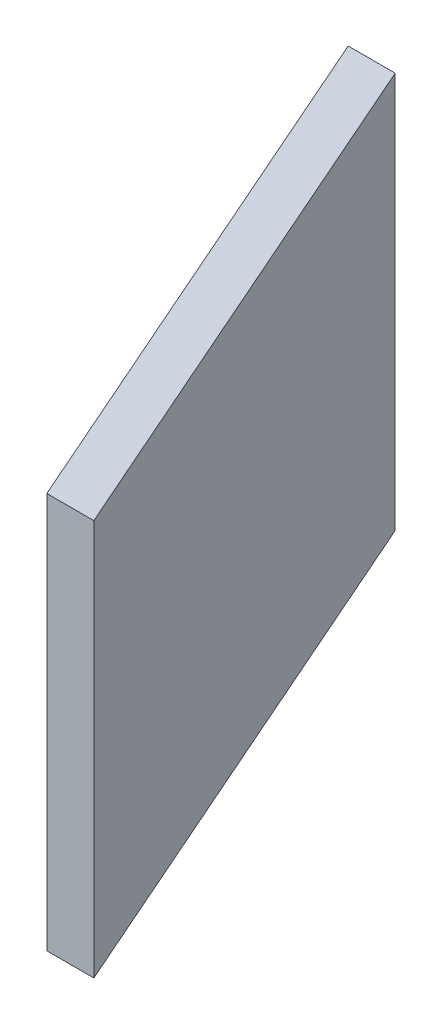
ISO-10303-21;
HEADER;
FILE_DESCRIPTION(('STEP AP214'),'2;1');
FILE_NAME('part.step','',(''),(''),'','','');
FILE_SCHEMA(('AUTOMOTIVE_DESIGN { 1 0 10303 214 1 1 1 1 }'));
ENDSEC;
DATA;
#1=APPLICATION_CONTEXT('core data for automotive mechanical design processes');
#2=APPLICATION_PROTOCOL_DEFINITION('international standard','automotive_design',2000,#1);
#3=PRODUCT_CONTEXT('',#1,'mechanical');
#4=PRODUCT('Part','Part','',(#3));
#5=PRODUCT_RELATED_PRODUCT_CATEGORY('part','',(#4));
#6=PRODUCT_DEFINITION_FORMATION('','',#4);
#7=PRODUCT_DEFINITION_CONTEXT('part definition',#1,'design');
#8=PRODUCT_DEFINITION('design','',#6,#7);
#9=PRODUCT_DEFINITION_SHAPE('','',#8);
#10=(LENGTH_UNIT() NAMED_UNIT(*) SI_UNIT(.MILLI.,.METRE.));
#11=(NAMED_UNIT(*) PLANE_ANGLE_UNIT() SI_UNIT($,.RADIAN.));
#12=(NAMED_UNIT(*) SI_UNIT($,.STERADIAN.) SOLID_ANGLE_UNIT());
#13=UNCERTAINTY_MEASURE_WITH_UNIT(LENGTH_MEASURE(1.E-05),#10,'distance_accuracy_value','');
#14=(GEOMETRIC_REPRESENTATION_CONTEXT(3) GLOBAL_UNCERTAINTY_ASSIGNED_CONTEXT((#13)) GLOBAL_UNIT_ASSIGNED_CONTEXT((#10,
#11,#12)) REPRESENTATION_CONTEXT('',''));
#15=CARTESIAN_POINT('',(0.,0.,0.));
#16=DIRECTION('',(0.,0.,1.));
#17=DIRECTION('',(1.,0.,0.));
#18=AXIS2_PLACEMENT_3D('',#15,#16,#17);
#19=CARTESIAN_POINT('',(2.18504852787824,18.4,0.));
#20=DIRECTION('',(0.,0.,-1.));
#21=DIRECTION('',(-1.,0.,0.));
#22=AXIS2_PLACEMENT_3D('',#19,#20,#21);
#23=PLANE('',#22);
#24=DIRECTION('',(1.,0.,0.));
#25=VECTOR('',#24,1.);
#26=CARTESIAN_POINT('',(2.18504852787824,0.,0.));
#27=LINE('',#26,#25);
#28=CARTESIAN_POINT('',(0.,0.,0.));
#29=VERTEX_POINT('',#28);
#30=CARTESIAN_POINT('',(2.18504852787824,0.,0.));
#31=VERTEX_POINT('',#30);
#32=EDGE_CURVE('E100',#29,#31,#27,.T.);
#33=ORIENTED_EDGE('',*,*,#32,.T.);
#34=DIRECTION('',(0.,-1.,0.));
#35=VECTOR('',#34,1.);
#36=CARTESIAN_POINT('',(2.18504852787824,18.4,0.));
#37=LINE('',#36,#35);
#38=CARTESIAN_POINT('',(2.18504852787824,18.4,0.));
#39=VERTEX_POINT('',#38);
#40=EDGE_CURVE('E11',#39,#31,#37,.T.);
#41=ORIENTED_EDGE('',*,*,#40,.F.);
#42=DIRECTION('',(1.,0.,0.));
#43=VECTOR('',#42,1.);
#44=CARTESIAN_POINT('',(2.18504852787824,18.4,0.));
#45=LINE('',#44,#43);
#46=CARTESIAN_POINT('',(0.,18.4,0.));
#47=VERTEX_POINT('',#46);
#48=EDGE_CURVE('E88',#47,#39,#45,.T.);
#49=ORIENTED_EDGE('',*,*,#48,.F.);
#50=DIRECTION('',(0.,-1.,0.));
#51=VECTOR('',#50,1.);
#52=CARTESIAN_POINT('',(0.,18.4,0.));
#53=LINE('',#52,#51);
#54=EDGE_CURVE('E96',#47,#29,#53,.T.);
#55=ORIENTED_EDGE('',*,*,#54,.T.);
#56=EDGE_LOOP('',(#33,#41,#49,#55));
#57=FACE_BOUND('',#56,.T.);
#58=ADVANCED_FACE('F37',(#57),#23,.F.);
#59=CARTESIAN_POINT('',(-8.81521474441752,18.4,-25.));
#60=DIRECTION('',(-0.915311479119448,0.,0.402746689858735));
#61=DIRECTION('',(0.402746689858735,0.,0.915311479119448));
#62=AXIS2_PLACEMENT_3D('',#59,#60,#61);
#63=PLANE('',#62);
#64=DIRECTION('',(-0.402746689858735,0.,-0.915311479119448));
#65=VECTOR('',#64,1.);
#66=CARTESIAN_POINT('',(-8.81521474441752,0.,-25.));
#67=LINE('',#66,#65);
#68=CARTESIAN_POINT('',(-8.81521474441752,0.,-25.));
#69=VERTEX_POINT('',#68);
#70=EDGE_CURVE('E92',#31,#69,#67,.T.);
#71=ORIENTED_EDGE('',*,*,#70,.T.);
#72=DIRECTION('',(0.,-1.,0.));
#73=VECTOR('',#72,1.);
#74=CARTESIAN_POINT('',(-8.81521474441752,18.4,-25.));
#75=LINE('',#74,#73);
#76=CARTESIAN_POINT('',(-8.81521474441752,18.4,-25.));
#77=VERTEX_POINT('',#76);
#78=EDGE_CURVE('E45',#77,#69,#75,.T.);
#79=ORIENTED_EDGE('',*,*,#78,.F.);
#80=DIRECTION('',(-0.402746689858735,0.,-0.915311479119448));
#81=VECTOR('',#80,1.);
#82=CARTESIAN_POINT('',(-8.81521474441752,18.4,-25.));
#83=LINE('',#82,#81);
#84=EDGE_CURVE('E83',#39,#77,#83,.T.);
#85=ORIENTED_EDGE('',*,*,#84,.F.);
#86=ORIENTED_EDGE('',*,*,#40,.T.);
#87=EDGE_LOOP('',(#71,#79,#85,#86));
#88=FACE_BOUND('',#87,.T.);
#89=ADVANCED_FACE('F91',(#88),#63,.F.);
#90=CARTESIAN_POINT('',(-11.0002632722958,18.4,-25.));
#91=DIRECTION('',(0.,0.,1.));
#92=DIRECTION('',(1.,0.,0.));
#93=AXIS2_PLACEMENT_3D('',#90,#91,#92);
#94=PLANE('',#93);
#95=DIRECTION('',(-1.,0.,0.));
#96=VECTOR('',#95,1.);
#97=CARTESIAN_POINT('',(-11.0002632722958,0.,-25.));
#98=LINE('',#97,#96);
#99=CARTESIAN_POINT('',(-11.0002632722958,0.,-25.));
#100=VERTEX_POINT('',#99);
#101=EDGE_CURVE('E70',#69,#100,#98,.T.);
#102=ORIENTED_EDGE('',*,*,#101,.T.);
#103=DIRECTION('',(0.,-1.,0.));
#104=VECTOR('',#103,1.);
#105=CARTESIAN_POINT('',(-11.0002632722958,18.4,-25.));
#106=LINE('',#105,#104);
#107=CARTESIAN_POINT('',(-11.0002632722958,18.4,-25.));
#108=VERTEX_POINT('',#107);
#109=EDGE_CURVE('E93',#108,#100,#106,.T.);
#110=ORIENTED_EDGE('',*,*,#109,.F.);
#111=DIRECTION('',(-1.,0.,0.));
#112=VECTOR('',#111,1.);
#113=CARTESIAN_POINT('',(-11.0002632722958,18.4,-25.));
#114=LINE('',#113,#112);
#115=EDGE_CURVE('E86',#77,#108,#114,.T.);
#116=ORIENTED_EDGE('',*,*,#115,.F.);
#117=ORIENTED_EDGE('',*,*,#78,.T.);
#118=EDGE_LOOP('',(#102,#110,#116,#117));
#119=FACE_BOUND('',#118,.T.);
#120=ADVANCED_FACE('F94',(#119),#94,.F.);
#121=CARTESIAN_POINT('',(0.,18.4,0.));
#122=DIRECTION('',(0.915311479119448,0.,-0.402746689858735));
#123=DIRECTION('',(-0.402746689858735,0.,-0.915311479119448));
#124=AXIS2_PLACEMENT_3D('',#121,#122,#123);
#125=PLANE('',#124);
#126=DIRECTION('',(0.402746689858735,0.,0.915311479119448));
#127=VECTOR('',#126,1.);
#128=CARTESIAN_POINT('',(0.,0.,0.));
#129=LINE('',#128,#127);
#130=EDGE_CURVE('E76',#100,#29,#129,.T.);
#131=ORIENTED_EDGE('',*,*,#130,.T.);
#132=ORIENTED_EDGE('',*,*,#54,.F.);
#133=DIRECTION('',(0.402746689858735,0.,0.915311479119448));
#134=VECTOR('',#133,1.);
#135=CARTESIAN_POINT('',(0.,18.4,0.));
#136=LINE('',#135,#134);
#137=EDGE_CURVE('E53',#108,#47,#136,.T.);
#138=ORIENTED_EDGE('',*,*,#137,.F.);
#139=ORIENTED_EDGE('',*,*,#109,.T.);
#140=EDGE_LOOP('',(#131,#132,#138,#139));
#141=FACE_BOUND('',#140,.T.);
#142=ADVANCED_FACE('F107',(#141),#125,.F.);
#143=CARTESIAN_POINT('',(0.,18.4,0.));
#144=DIRECTION('',(0.,-1.,0.));
#145=DIRECTION('',(0.,0.,-1.));
#146=AXIS2_PLACEMENT_3D('',#143,#144,#145);
#147=PLANE('',#146);
#148=ORIENTED_EDGE('',*,*,#48,.T.);
#149=ORIENTED_EDGE('',*,*,#84,.T.);
#150=ORIENTED_EDGE('',*,*,#115,.T.);
#151=ORIENTED_EDGE('',*,*,#137,.T.);
#152=EDGE_LOOP('',(#148,#149,#150,#151));
#153=FACE_BOUND('',#152,.T.);
#154=ADVANCED_FACE('F84',(#153),#147,.F.);
#155=CARTESIAN_POINT('',(0.,0.,0.));
#156=DIRECTION('',(0.,-1.,0.));
#157=DIRECTION('',(0.,0.,-1.));
#158=AXIS2_PLACEMENT_3D('',#155,#156,#157);
#159=PLANE('',#158);
#160=ORIENTED_EDGE('',*,*,#32,.F.);
#161=ORIENTED_EDGE('',*,*,#130,.F.);
#162=ORIENTED_EDGE('',*,*,#101,.F.);
#163=ORIENTED_EDGE('',*,*,#70,.F.);
#164=EDGE_LOOP('',(#160,#161,#162,#163));
#165=FACE_BOUND('',#164,.T.);
#166=ADVANCED_FACE('F110',(#165),#159,.T.);
#167=CLOSED_SHELL('',(#58,#89,#120,#142,#154,#166));
#168=MANIFOLD_SOLID_BREP('B2',#167);
#169=ADVANCED_BREP_SHAPE_REPRESENTATION('',(#18,#168),#14);
#170=SHAPE_DEFINITION_REPRESENTATION(#9,#169);
ENDSEC;
END-ISO-10303-21;
